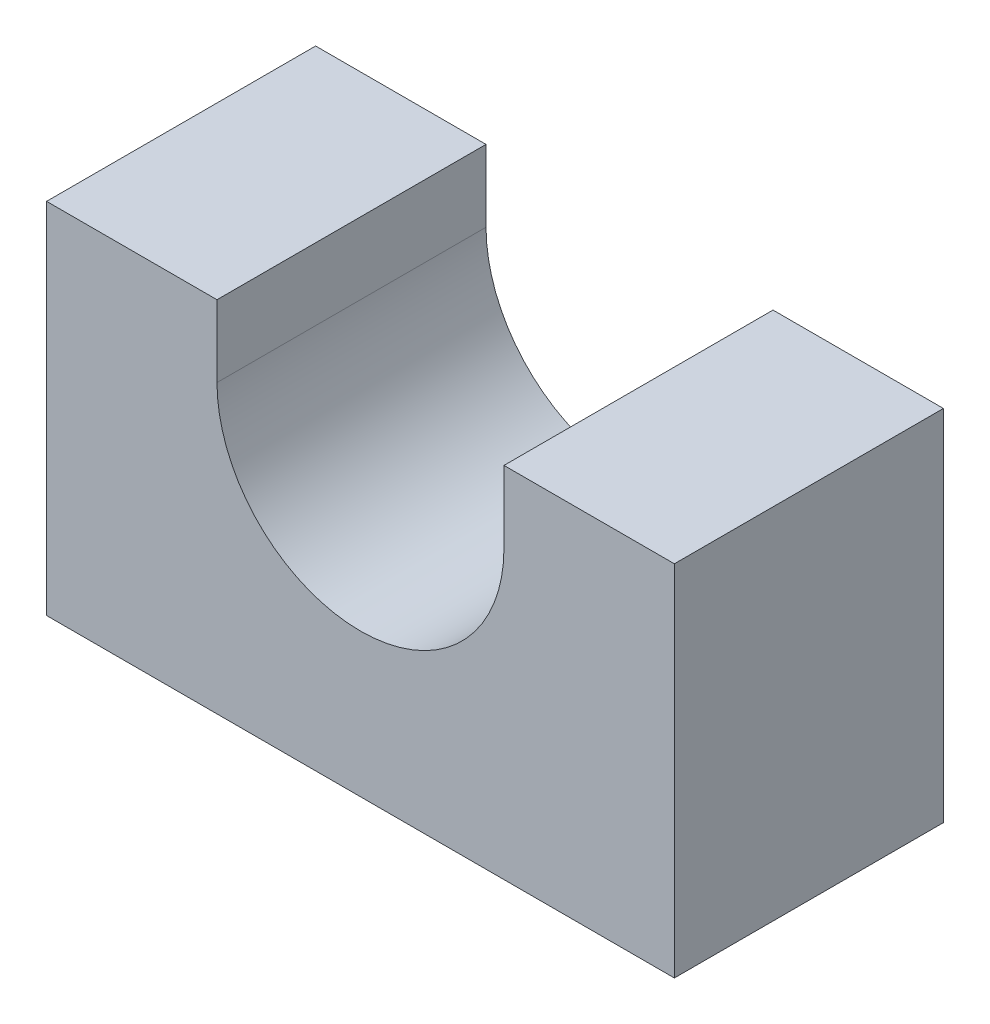
ISO-10303-21;
HEADER;
FILE_DESCRIPTION(('STEP AP214'),'2;1');
FILE_NAME('part.step','',(''),(''),'','','');
FILE_SCHEMA(('AUTOMOTIVE_DESIGN { 1 0 10303 214 1 1 1 1 }'));
ENDSEC;
DATA;
#1=APPLICATION_CONTEXT('core data for automotive mechanical design processes');
#2=APPLICATION_PROTOCOL_DEFINITION('international standard','automotive_design',2000,#1);
#3=PRODUCT_CONTEXT('',#1,'mechanical');
#4=PRODUCT('Part','Part','',(#3));
#5=PRODUCT_RELATED_PRODUCT_CATEGORY('part','',(#4));
#6=PRODUCT_DEFINITION_FORMATION('','',#4);
#7=PRODUCT_DEFINITION_CONTEXT('part definition',#1,'design');
#8=PRODUCT_DEFINITION('design','',#6,#7);
#9=PRODUCT_DEFINITION_SHAPE('','',#8);
#10=(LENGTH_UNIT() NAMED_UNIT(*) SI_UNIT(.MILLI.,.METRE.));
#11=(NAMED_UNIT(*) PLANE_ANGLE_UNIT() SI_UNIT($,.RADIAN.));
#12=(NAMED_UNIT(*) SI_UNIT($,.STERADIAN.) SOLID_ANGLE_UNIT());
#13=UNCERTAINTY_MEASURE_WITH_UNIT(LENGTH_MEASURE(1.E-05),#10,'distance_accuracy_value','');
#14=(GEOMETRIC_REPRESENTATION_CONTEXT(3) GLOBAL_UNCERTAINTY_ASSIGNED_CONTEXT((#13)) GLOBAL_UNIT_ASSIGNED_CONTEXT((#10,
#11,#12)) REPRESENTATION_CONTEXT('',''));
#15=CARTESIAN_POINT('',(0.,0.,0.));
#16=DIRECTION('',(0.,0.,1.));
#17=DIRECTION('',(1.,0.,0.));
#18=AXIS2_PLACEMENT_3D('',#15,#16,#17);
#19=CARTESIAN_POINT('',(-175.,0.,150.));
#20=DIRECTION('',(1.,0.,0.));
#21=DIRECTION('',(0.,0.,-1.));
#22=AXIS2_PLACEMENT_3D('',#19,#20,#21);
#23=PLANE('',#22);
#24=DIRECTION('',(0.,-1.,0.));
#25=VECTOR('',#24,1.);
#26=CARTESIAN_POINT('',(-175.,0.,0.));
#27=LINE('',#26,#25);
#28=CARTESIAN_POINT('',(-175.,200.,0.));
#29=VERTEX_POINT('',#28);
#30=CARTESIAN_POINT('',(-175.,0.,0.));
#31=VERTEX_POINT('',#30);
#32=EDGE_CURVE('E132',#29,#31,#27,.T.);
#33=ORIENTED_EDGE('',*,*,#32,.T.);
#34=DIRECTION('',(0.,0.,-1.));
#35=VECTOR('',#34,1.);
#36=CARTESIAN_POINT('',(-175.,0.,150.));
#37=LINE('',#36,#35);
#38=CARTESIAN_POINT('',(-175.,0.,150.));
#39=VERTEX_POINT('',#38);
#40=EDGE_CURVE('E11',#39,#31,#37,.T.);
#41=ORIENTED_EDGE('',*,*,#40,.F.);
#42=DIRECTION('',(0.,-1.,0.));
#43=VECTOR('',#42,1.);
#44=CARTESIAN_POINT('',(-175.,0.,150.));
#45=LINE('',#44,#43);
#46=CARTESIAN_POINT('',(-175.,200.,150.));
#47=VERTEX_POINT('',#46);
#48=EDGE_CURVE('E146',#47,#39,#45,.T.);
#49=ORIENTED_EDGE('',*,*,#48,.F.);
#50=DIRECTION('',(0.,0.,-1.));
#51=VECTOR('',#50,1.);
#52=CARTESIAN_POINT('',(-175.,200.,150.));
#53=LINE('',#52,#51);
#54=EDGE_CURVE('E128',#47,#29,#53,.T.);
#55=ORIENTED_EDGE('',*,*,#54,.T.);
#56=EDGE_LOOP('',(#33,#41,#49,#55));
#57=FACE_BOUND('',#56,.T.);
#58=ADVANCED_FACE('F36',(#57),#23,.F.);
#59=CARTESIAN_POINT('',(-175.,0.,150.));
#60=DIRECTION('',(0.,1.,0.));
#61=DIRECTION('',(-1.,0.,0.));
#62=AXIS2_PLACEMENT_3D('',#59,#60,#61);
#63=PLANE('',#62);
#64=DIRECTION('',(1.,0.,0.));
#65=VECTOR('',#64,1.);
#66=CARTESIAN_POINT('',(-175.,0.,0.));
#67=LINE('',#66,#65);
#68=CARTESIAN_POINT('',(175.,0.,0.));
#69=VERTEX_POINT('',#68);
#70=EDGE_CURVE('E135',#31,#69,#67,.T.);
#71=ORIENTED_EDGE('',*,*,#70,.T.);
#72=DIRECTION('',(0.,0.,-1.));
#73=VECTOR('',#72,1.);
#74=CARTESIAN_POINT('',(175.,0.,150.));
#75=LINE('',#74,#73);
#76=CARTESIAN_POINT('',(175.,0.,150.));
#77=VERTEX_POINT('',#76);
#78=EDGE_CURVE('E44',#77,#69,#75,.T.);
#79=ORIENTED_EDGE('',*,*,#78,.F.);
#80=DIRECTION('',(1.,0.,0.));
#81=VECTOR('',#80,1.);
#82=CARTESIAN_POINT('',(-175.,0.,150.));
#83=LINE('',#82,#81);
#84=EDGE_CURVE('E95',#39,#77,#83,.T.);
#85=ORIENTED_EDGE('',*,*,#84,.F.);
#86=ORIENTED_EDGE('',*,*,#40,.T.);
#87=EDGE_LOOP('',(#71,#79,#85,#86));
#88=FACE_BOUND('',#87,.T.);
#89=ADVANCED_FACE('F181',(#88),#63,.F.);
#90=CARTESIAN_POINT('',(175.,0.,150.));
#91=DIRECTION('',(-1.,0.,0.));
#92=DIRECTION('',(0.,0.,1.));
#93=AXIS2_PLACEMENT_3D('',#90,#91,#92);
#94=PLANE('',#93);
#95=DIRECTION('',(0.,1.,0.));
#96=VECTOR('',#95,1.);
#97=CARTESIAN_POINT('',(175.,0.,0.));
#98=LINE('',#97,#96);
#99=CARTESIAN_POINT('',(175.,200.,0.));
#100=VERTEX_POINT('',#99);
#101=EDGE_CURVE('E137',#69,#100,#98,.T.);
#102=ORIENTED_EDGE('',*,*,#101,.T.);
#103=DIRECTION('',(0.,0.,-1.));
#104=VECTOR('',#103,1.);
#105=CARTESIAN_POINT('',(175.,200.,150.));
#106=LINE('',#105,#104);
#107=CARTESIAN_POINT('',(175.,200.,150.));
#108=VERTEX_POINT('',#107);
#109=EDGE_CURVE('E153',#108,#100,#106,.T.);
#110=ORIENTED_EDGE('',*,*,#109,.F.);
#111=DIRECTION('',(0.,1.,0.));
#112=VECTOR('',#111,1.);
#113=CARTESIAN_POINT('',(175.,0.,150.));
#114=LINE('',#113,#112);
#115=EDGE_CURVE('E161',#77,#108,#114,.T.);
#116=ORIENTED_EDGE('',*,*,#115,.F.);
#117=ORIENTED_EDGE('',*,*,#78,.T.);
#118=EDGE_LOOP('',(#102,#110,#116,#117));
#119=FACE_BOUND('',#118,.T.);
#120=ADVANCED_FACE('F159',(#119),#94,.F.);
#121=CARTESIAN_POINT('',(175.,200.,150.));
#122=DIRECTION('',(0.,-1.,0.));
#123=DIRECTION('',(1.,0.,0.));
#124=AXIS2_PLACEMENT_3D('',#121,#122,#123);
#125=PLANE('',#124);
#126=DIRECTION('',(-1.,0.,0.));
#127=VECTOR('',#126,1.);
#128=CARTESIAN_POINT('',(175.,200.,0.));
#129=LINE('',#128,#127);
#130=CARTESIAN_POINT('',(80.,200.,0.));
#131=VERTEX_POINT('',#130);
#132=EDGE_CURVE('E139',#100,#131,#129,.T.);
#133=ORIENTED_EDGE('',*,*,#132,.T.);
#134=DIRECTION('',(0.,0.,-1.));
#135=VECTOR('',#134,1.);
#136=CARTESIAN_POINT('',(80.,200.,150.));
#137=LINE('',#136,#135);
#138=CARTESIAN_POINT('',(80.,200.,150.));
#139=VERTEX_POINT('',#138);
#140=EDGE_CURVE('E150',#139,#131,#137,.T.);
#141=ORIENTED_EDGE('',*,*,#140,.F.);
#142=DIRECTION('',(-1.,0.,0.));
#143=VECTOR('',#142,1.);
#144=CARTESIAN_POINT('',(175.,200.,150.));
#145=LINE('',#144,#143);
#146=EDGE_CURVE('E173',#108,#139,#145,.T.);
#147=ORIENTED_EDGE('',*,*,#146,.F.);
#148=ORIENTED_EDGE('',*,*,#109,.T.);
#149=EDGE_LOOP('',(#133,#141,#147,#148));
#150=FACE_BOUND('',#149,.T.);
#151=ADVANCED_FACE('F169',(#150),#125,.F.);
#152=CARTESIAN_POINT('',(80.,200.,150.));
#153=DIRECTION('',(1.,0.,0.));
#154=DIRECTION('',(0.,1.,0.));
#155=AXIS2_PLACEMENT_3D('',#152,#153,#154);
#156=PLANE('',#155);
#157=DIRECTION('',(0.,-1.,0.));
#158=VECTOR('',#157,1.);
#159=CARTESIAN_POINT('',(80.,200.,0.));
#160=LINE('',#159,#158);
#161=CARTESIAN_POINT('',(80.,160.,0.));
#162=VERTEX_POINT('',#161);
#163=EDGE_CURVE('E141',#131,#162,#160,.T.);
#164=ORIENTED_EDGE('',*,*,#163,.T.);
#165=DIRECTION('',(0.,0.,-1.));
#166=VECTOR('',#165,1.);
#167=CARTESIAN_POINT('',(80.,160.,150.));
#168=LINE('',#167,#166);
#169=CARTESIAN_POINT('',(80.,160.,150.));
#170=VERTEX_POINT('',#169);
#171=EDGE_CURVE('E123',#170,#162,#168,.T.);
#172=ORIENTED_EDGE('',*,*,#171,.F.);
#173=DIRECTION('',(0.,-1.,0.));
#174=VECTOR('',#173,1.);
#175=CARTESIAN_POINT('',(80.,200.,150.));
#176=LINE('',#175,#174);
#177=EDGE_CURVE('E114',#139,#170,#176,.T.);
#178=ORIENTED_EDGE('',*,*,#177,.F.);
#179=ORIENTED_EDGE('',*,*,#140,.T.);
#180=EDGE_LOOP('',(#164,#172,#178,#179));
#181=FACE_BOUND('',#180,.T.);
#182=ADVANCED_FACE('F172',(#181),#156,.F.);
#183=CARTESIAN_POINT('',(0.,160.,150.));
#184=DIRECTION('',(0.,0.,-1.));
#185=DIRECTION('',(-1.,0.,0.));
#186=AXIS2_PLACEMENT_3D('',#183,#184,#185);
#187=CYLINDRICAL_SURFACE('',#186,80.);
#188=CARTESIAN_POINT('',(0.,160.,0.));
#189=DIRECTION('',(0.,0.,-1.));
#190=DIRECTION('',(1.,0.,0.));
#191=AXIS2_PLACEMENT_3D('',#188,#189,#190);
#192=CIRCLE('',#191,80.);
#193=CARTESIAN_POINT('',(-80.,160.,0.));
#194=VERTEX_POINT('',#193);
#195=EDGE_CURVE('E122',#162,#194,#192,.T.);
#196=ORIENTED_EDGE('',*,*,#195,.T.);
#197=DIRECTION('',(0.,0.,-1.));
#198=VECTOR('',#197,1.);
#199=CARTESIAN_POINT('',(-80.,160.,150.));
#200=LINE('',#199,#198);
#201=CARTESIAN_POINT('',(-80.,160.,150.));
#202=VERTEX_POINT('',#201);
#203=EDGE_CURVE('E119',#202,#194,#200,.T.);
#204=ORIENTED_EDGE('',*,*,#203,.F.);
#205=CARTESIAN_POINT('',(0.,160.,150.));
#206=DIRECTION('',(0.,0.,-1.));
#207=DIRECTION('',(1.,0.,0.));
#208=AXIS2_PLACEMENT_3D('',#205,#206,#207);
#209=CIRCLE('',#208,80.);
#210=EDGE_CURVE('E108',#170,#202,#209,.T.);
#211=ORIENTED_EDGE('',*,*,#210,.F.);
#212=ORIENTED_EDGE('',*,*,#171,.T.);
#213=EDGE_LOOP('',(#196,#204,#211,#212));
#214=FACE_BOUND('',#213,.T.);
#215=ADVANCED_FACE('F120',(#214),#187,.F.);
#216=CARTESIAN_POINT('',(-80.,200.,150.));
#217=DIRECTION('',(-1.,0.,0.));
#218=DIRECTION('',(0.,-1.,0.));
#219=AXIS2_PLACEMENT_3D('',#216,#217,#218);
#220=PLANE('',#219);
#221=DIRECTION('',(0.,1.,0.));
#222=VECTOR('',#221,1.);
#223=CARTESIAN_POINT('',(-80.,200.,0.));
#224=LINE('',#223,#222);
#225=CARTESIAN_POINT('',(-80.,200.,0.));
#226=VERTEX_POINT('',#225);
#227=EDGE_CURVE('E81',#194,#226,#224,.T.);
#228=ORIENTED_EDGE('',*,*,#227,.T.);
#229=DIRECTION('',(0.,0.,-1.));
#230=VECTOR('',#229,1.);
#231=CARTESIAN_POINT('',(-80.,200.,150.));
#232=LINE('',#231,#230);
#233=CARTESIAN_POINT('',(-80.,200.,150.));
#234=VERTEX_POINT('',#233);
#235=EDGE_CURVE('E124',#234,#226,#232,.T.);
#236=ORIENTED_EDGE('',*,*,#235,.F.);
#237=DIRECTION('',(0.,1.,0.));
#238=VECTOR('',#237,1.);
#239=CARTESIAN_POINT('',(-80.,200.,150.));
#240=LINE('',#239,#238);
#241=EDGE_CURVE('E112',#202,#234,#240,.T.);
#242=ORIENTED_EDGE('',*,*,#241,.F.);
#243=ORIENTED_EDGE('',*,*,#203,.T.);
#244=EDGE_LOOP('',(#228,#236,#242,#243));
#245=FACE_BOUND('',#244,.T.);
#246=ADVANCED_FACE('F126',(#245),#220,.F.);
#247=CARTESIAN_POINT('',(-175.,200.,150.));
#248=DIRECTION('',(0.,-1.,0.));
#249=DIRECTION('',(1.,0.,0.));
#250=AXIS2_PLACEMENT_3D('',#247,#248,#249);
#251=PLANE('',#250);
#252=DIRECTION('',(-1.,0.,0.));
#253=VECTOR('',#252,1.);
#254=CARTESIAN_POINT('',(-175.,200.,0.));
#255=LINE('',#254,#253);
#256=EDGE_CURVE('E87',#226,#29,#255,.T.);
#257=ORIENTED_EDGE('',*,*,#256,.T.);
#258=ORIENTED_EDGE('',*,*,#54,.F.);
#259=DIRECTION('',(-1.,0.,0.));
#260=VECTOR('',#259,1.);
#261=CARTESIAN_POINT('',(-175.,200.,150.));
#262=LINE('',#261,#260);
#263=EDGE_CURVE('E52',#234,#47,#262,.T.);
#264=ORIENTED_EDGE('',*,*,#263,.F.);
#265=ORIENTED_EDGE('',*,*,#235,.T.);
#266=EDGE_LOOP('',(#257,#258,#264,#265));
#267=FACE_BOUND('',#266,.T.);
#268=ADVANCED_FACE('F197',(#267),#251,.F.);
#269=CARTESIAN_POINT('',(0.,160.,150.));
#270=DIRECTION('',(0.,0.,1.));
#271=DIRECTION('',(1.,0.,0.));
#272=AXIS2_PLACEMENT_3D('',#269,#270,#271);
#273=PLANE('',#272);
#274=ORIENTED_EDGE('',*,*,#48,.T.);
#275=ORIENTED_EDGE('',*,*,#84,.T.);
#276=ORIENTED_EDGE('',*,*,#115,.T.);
#277=ORIENTED_EDGE('',*,*,#146,.T.);
#278=ORIENTED_EDGE('',*,*,#177,.T.);
#279=ORIENTED_EDGE('',*,*,#210,.T.);
#280=ORIENTED_EDGE('',*,*,#241,.T.);
#281=ORIENTED_EDGE('',*,*,#263,.T.);
#282=EDGE_LOOP('',(#274,#275,#276,#277,#278,#279,#280,#281));
#283=FACE_BOUND('',#282,.T.);
#284=ADVANCED_FACE('F110',(#283),#273,.T.);
#285=CARTESIAN_POINT('',(0.,160.,0.));
#286=DIRECTION('',(0.,0.,1.));
#287=DIRECTION('',(1.,0.,0.));
#288=AXIS2_PLACEMENT_3D('',#285,#286,#287);
#289=PLANE('',#288);
#290=ORIENTED_EDGE('',*,*,#32,.F.);
#291=ORIENTED_EDGE('',*,*,#256,.F.);
#292=ORIENTED_EDGE('',*,*,#227,.F.);
#293=ORIENTED_EDGE('',*,*,#195,.F.);
#294=ORIENTED_EDGE('',*,*,#163,.F.);
#295=ORIENTED_EDGE('',*,*,#132,.F.);
#296=ORIENTED_EDGE('',*,*,#101,.F.);
#297=ORIENTED_EDGE('',*,*,#70,.F.);
#298=EDGE_LOOP('',(#290,#291,#292,#293,#294,#295,#296,#297));
#299=FACE_BOUND('',#298,.T.);
#300=ADVANCED_FACE('F165',(#299),#289,.F.);
#301=CLOSED_SHELL('',(#58,#89,#120,#151,#182,#215,#246,#268,#284,#300));
#302=MANIFOLD_SOLID_BREP('B2',#301);
#303=ADVANCED_BREP_SHAPE_REPRESENTATION('',(#18,#302),#14);
#304=SHAPE_DEFINITION_REPRESENTATION(#9,#303);
ENDSEC;
END-ISO-10303-21;
